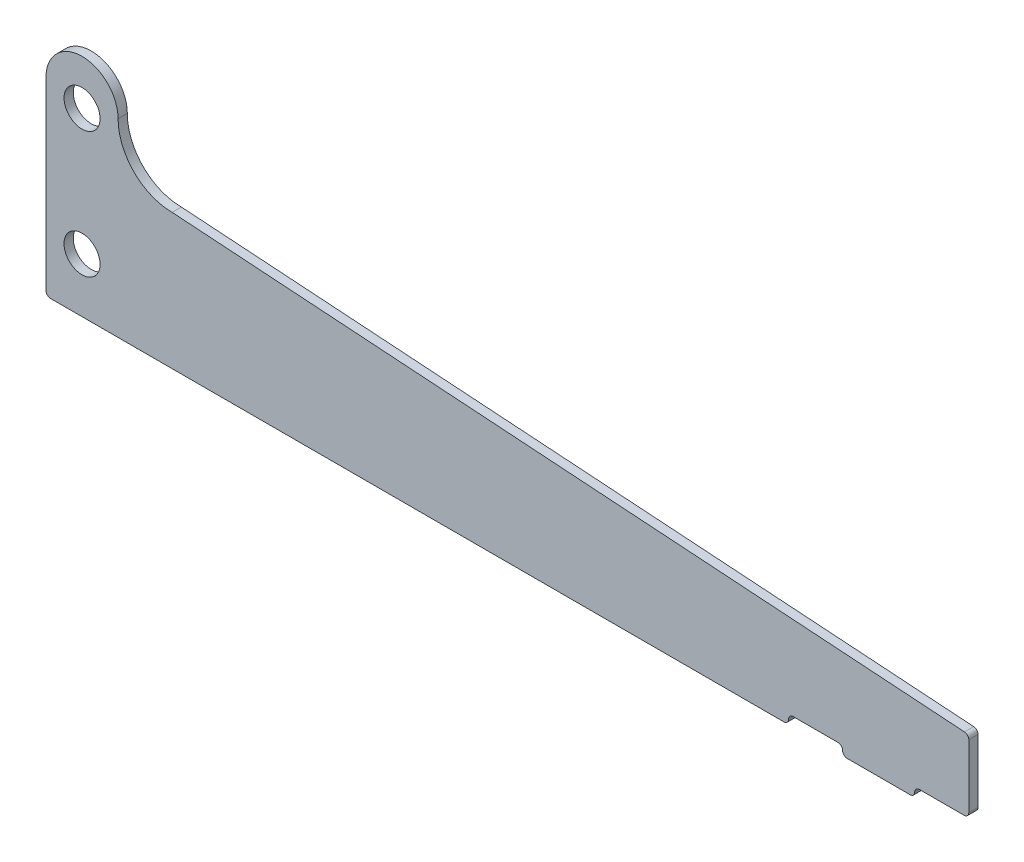
ISO-10303-21;
HEADER;
FILE_DESCRIPTION(('STEP AP214'),'2;1');
FILE_NAME('part.step','',(''),(''),'','','');
FILE_SCHEMA(('AUTOMOTIVE_DESIGN { 1 0 10303 214 1 1 1 1 }'));
ENDSEC;
DATA;
#1=APPLICATION_CONTEXT('core data for automotive mechanical design processes');
#2=APPLICATION_PROTOCOL_DEFINITION('international standard','automotive_design',2000,#1);
#3=PRODUCT_CONTEXT('',#1,'mechanical');
#4=PRODUCT('Part','Part','',(#3));
#5=PRODUCT_RELATED_PRODUCT_CATEGORY('part','',(#4));
#6=PRODUCT_DEFINITION_FORMATION('','',#4);
#7=PRODUCT_DEFINITION_CONTEXT('part definition',#1,'design');
#8=PRODUCT_DEFINITION('design','',#6,#7);
#9=PRODUCT_DEFINITION_SHAPE('','',#8);
#10=(LENGTH_UNIT() NAMED_UNIT(*) SI_UNIT(.MILLI.,.METRE.));
#11=(NAMED_UNIT(*) PLANE_ANGLE_UNIT() SI_UNIT($,.RADIAN.));
#12=(NAMED_UNIT(*) SI_UNIT($,.STERADIAN.) SOLID_ANGLE_UNIT());
#13=UNCERTAINTY_MEASURE_WITH_UNIT(LENGTH_MEASURE(1.E-05),#10,'distance_accuracy_value','');
#14=(GEOMETRIC_REPRESENTATION_CONTEXT(3) GLOBAL_UNCERTAINTY_ASSIGNED_CONTEXT((#13)) GLOBAL_UNIT_ASSIGNED_CONTEXT((#10,
#11,#12)) REPRESENTATION_CONTEXT('',''));
#15=CARTESIAN_POINT('',(0.,0.,0.));
#16=DIRECTION('',(0.,0.,1.));
#17=DIRECTION('',(1.,0.,0.));
#18=AXIS2_PLACEMENT_3D('',#15,#16,#17);
#19=CARTESIAN_POINT('',(11.1125,15.875,0.8128));
#20=DIRECTION('',(0.,0.,-1.));
#21=DIRECTION('',(-1.,0.,0.));
#22=AXIS2_PLACEMENT_3D('',#19,#20,#21);
#23=CYLINDRICAL_SURFACE('',#22,4.76250000000001);
#24=CARTESIAN_POINT('',(11.1125,15.875,0.));
#25=DIRECTION('',(0.,0.,1.));
#26=DIRECTION('',(1.,0.,0.));
#27=AXIS2_PLACEMENT_3D('',#24,#25,#26);
#28=CIRCLE('',#27,4.76250000000001);
#29=CARTESIAN_POINT('',(6.34999999999999,15.875,0.));
#30=VERTEX_POINT('',#29);
#31=CARTESIAN_POINT('',(11.1125,11.1125,0.));
#32=VERTEX_POINT('',#31);
#33=EDGE_CURVE('E175',#30,#32,#28,.T.);
#34=ORIENTED_EDGE('',*,*,#33,.F.);
#35=DIRECTION('',(0.,0.,-1.));
#36=VECTOR('',#35,1.);
#37=CARTESIAN_POINT('',(6.34999999999999,15.875,0.8128));
#38=LINE('',#37,#36);
#39=CARTESIAN_POINT('',(6.34999999999999,15.875,0.8128));
#40=VERTEX_POINT('',#39);
#41=EDGE_CURVE('E170',#40,#30,#38,.T.);
#42=ORIENTED_EDGE('',*,*,#41,.F.);
#43=CARTESIAN_POINT('',(11.1125,15.875,0.8128));
#44=DIRECTION('',(0.,0.,1.));
#45=DIRECTION('',(1.,0.,0.));
#46=AXIS2_PLACEMENT_3D('',#43,#44,#45);
#47=CIRCLE('',#46,4.76250000000001);
#48=CARTESIAN_POINT('',(11.1125,11.1125,0.8128));
#49=VERTEX_POINT('',#48);
#50=EDGE_CURVE('E173',#40,#49,#47,.T.);
#51=ORIENTED_EDGE('',*,*,#50,.T.);
#52=DIRECTION('',(0.,0.,-1.));
#53=VECTOR('',#52,1.);
#54=CARTESIAN_POINT('',(11.1125,11.1125,0.8128));
#55=LINE('',#54,#53);
#56=EDGE_CURVE('E231',#49,#32,#55,.T.);
#57=ORIENTED_EDGE('',*,*,#56,.T.);
#58=EDGE_LOOP('',(#34,#42,#51,#57));
#59=FACE_BOUND('',#58,.T.);
#60=ADVANCED_FACE('F41',(#59),#23,.F.);
#61=CARTESIAN_POINT('',(3.17499999999999,15.875,0.8128));
#62=DIRECTION('',(0.,0.,-1.));
#63=DIRECTION('',(-1.,0.,0.));
#64=AXIS2_PLACEMENT_3D('',#61,#62,#63);
#65=CYLINDRICAL_SURFACE('',#64,3.17499999999999);
#66=CARTESIAN_POINT('',(3.17499999999999,15.875,0.));
#67=DIRECTION('',(0.,0.,1.));
#68=DIRECTION('',(1.,0.,0.));
#69=AXIS2_PLACEMENT_3D('',#66,#67,#68);
#70=CIRCLE('',#69,3.17499999999999);
#71=CARTESIAN_POINT('',(0.,15.875,0.));
#72=VERTEX_POINT('',#71);
#73=EDGE_CURVE('E234',#30,#72,#70,.T.);
#74=ORIENTED_EDGE('',*,*,#73,.T.);
#75=DIRECTION('',(0.,0.,-1.));
#76=VECTOR('',#75,1.);
#77=CARTESIAN_POINT('',(0.,15.875,0.8128));
#78=LINE('',#77,#76);
#79=CARTESIAN_POINT('',(0.,15.875,0.8128));
#80=VERTEX_POINT('',#79);
#81=EDGE_CURVE('E181',#80,#72,#78,.T.);
#82=ORIENTED_EDGE('',*,*,#81,.F.);
#83=CARTESIAN_POINT('',(3.17499999999999,15.875,0.8128));
#84=DIRECTION('',(0.,0.,1.));
#85=DIRECTION('',(1.,0.,0.));
#86=AXIS2_PLACEMENT_3D('',#83,#84,#85);
#87=CIRCLE('',#86,3.17499999999999);
#88=EDGE_CURVE('E185',#40,#80,#87,.T.);
#89=ORIENTED_EDGE('',*,*,#88,.F.);
#90=ORIENTED_EDGE('',*,*,#41,.T.);
#91=EDGE_LOOP('',(#74,#82,#89,#90));
#92=FACE_BOUND('',#91,.T.);
#93=ADVANCED_FACE('F186',(#92),#65,.T.);
#94=CARTESIAN_POINT('',(0.,0.,0.8128));
#95=DIRECTION('',(-1.,0.,0.));
#96=DIRECTION('',(0.,0.,1.));
#97=AXIS2_PLACEMENT_3D('',#94,#95,#96);
#98=PLANE('',#97);
#99=DIRECTION('',(0.,1.,0.));
#100=VECTOR('',#99,1.);
#101=CARTESIAN_POINT('',(0.,0.,0.));
#102=LINE('',#101,#100);
#103=CARTESIAN_POINT('',(0.,-0.4064,0.));
#104=VERTEX_POINT('',#103);
#105=EDGE_CURVE('E238',#104,#72,#102,.T.);
#106=ORIENTED_EDGE('',*,*,#105,.F.);
#107=DIRECTION('',(0.,0.,-1.));
#108=VECTOR('',#107,1.);
#109=CARTESIAN_POINT('',(0.,-0.4064,0.8128));
#110=LINE('',#109,#108);
#111=CARTESIAN_POINT('',(0.,-0.4064,0.8128));
#112=VERTEX_POINT('',#111);
#113=EDGE_CURVE('E293',#104,#112,#110,.F.);
#114=ORIENTED_EDGE('',*,*,#113,.T.);
#115=DIRECTION('',(0.,1.,0.));
#116=VECTOR('',#115,1.);
#117=CARTESIAN_POINT('',(0.,0.,0.8128));
#118=LINE('',#117,#116);
#119=EDGE_CURVE('E190',#112,#80,#118,.T.);
#120=ORIENTED_EDGE('',*,*,#119,.T.);
#121=ORIENTED_EDGE('',*,*,#81,.T.);
#122=EDGE_LOOP('',(#106,#114,#120,#121));
#123=FACE_BOUND('',#122,.T.);
#124=ADVANCED_FACE('F394',(#123),#98,.T.);
#125=CARTESIAN_POINT('',(0.,-0.8128,0.8128));
#126=DIRECTION('',(0.,1.,0.));
#127=DIRECTION('',(-1.,0.,0.));
#128=AXIS2_PLACEMENT_3D('',#125,#126,#127);
#129=PLANE('',#128);
#130=DIRECTION('',(1.,0.,0.));
#131=VECTOR('',#130,1.);
#132=CARTESIAN_POINT('',(0.,-0.8128,0.8128));
#133=LINE('',#132,#131);
#134=CARTESIAN_POINT('',(0.4064,-0.8128,0.8128));
#135=VERTEX_POINT('',#134);
#136=CARTESIAN_POINT('',(65.0010384,-0.8128,0.8128));
#137=VERTEX_POINT('',#136);
#138=EDGE_CURVE('E205',#135,#137,#133,.T.);
#139=ORIENTED_EDGE('',*,*,#138,.F.);
#140=DIRECTION('',(0.,0.,-1.));
#141=VECTOR('',#140,1.);
#142=CARTESIAN_POINT('',(0.4064,-0.8128,0.));
#143=LINE('',#142,#141);
#144=CARTESIAN_POINT('',(0.4064,-0.8128,0.));
#145=VERTEX_POINT('',#144);
#146=EDGE_CURVE('E271',#135,#145,#143,.T.);
#147=ORIENTED_EDGE('',*,*,#146,.T.);
#148=DIRECTION('',(1.,0.,0.));
#149=VECTOR('',#148,1.);
#150=CARTESIAN_POINT('',(0.,-0.8128,0.));
#151=LINE('',#150,#149);
#152=CARTESIAN_POINT('',(65.0010384,-0.8128,0.));
#153=VERTEX_POINT('',#152);
#154=EDGE_CURVE('E241',#145,#153,#151,.T.);
#155=ORIENTED_EDGE('',*,*,#154,.T.);
#156=DIRECTION('',(0.,0.,-1.));
#157=VECTOR('',#156,1.);
#158=CARTESIAN_POINT('',(65.0010384,-0.8128,0.8128));
#159=LINE('',#158,#157);
#160=EDGE_CURVE('E180',#153,#137,#159,.F.);
#161=ORIENTED_EDGE('',*,*,#160,.T.);
#162=EDGE_LOOP('',(#139,#147,#155,#161));
#163=FACE_BOUND('',#162,.T.);
#164=ADVANCED_FACE('F384',(#163),#129,.F.);
#165=CARTESIAN_POINT('',(0.,0.,0.8128));
#166=DIRECTION('',(0.,-1.,0.));
#167=DIRECTION('',(1.,0.,0.));
#168=AXIS2_PLACEMENT_3D('',#165,#166,#167);
#169=PLANE('',#168);
#170=DIRECTION('',(-1.,0.,0.));
#171=VECTOR('',#170,1.);
#172=CARTESIAN_POINT('',(0.,0.,0.));
#173=LINE('',#172,#171);
#174=CARTESIAN_POINT('',(69.7635384,0.,0.));
#175=VERTEX_POINT('',#174);
#176=CARTESIAN_POINT('',(65.8138384,0.,0.));
#177=VERTEX_POINT('',#176);
#178=EDGE_CURVE('E247',#175,#177,#173,.T.);
#179=ORIENTED_EDGE('',*,*,#178,.F.);
#180=DIRECTION('',(0.,0.,-1.));
#181=VECTOR('',#180,1.);
#182=CARTESIAN_POINT('',(69.7635384,0.,0.8128));
#183=LINE('',#182,#181);
#184=CARTESIAN_POINT('',(69.7635384,0.,0.8128));
#185=VERTEX_POINT('',#184);
#186=EDGE_CURVE('E341',#175,#185,#183,.F.);
#187=ORIENTED_EDGE('',*,*,#186,.T.);
#188=DIRECTION('',(-1.,0.,0.));
#189=VECTOR('',#188,1.);
#190=CARTESIAN_POINT('',(0.,0.,0.8128));
#191=LINE('',#190,#189);
#192=CARTESIAN_POINT('',(65.8138384,0.,0.8128));
#193=VERTEX_POINT('',#192);
#194=EDGE_CURVE('E211',#185,#193,#191,.T.);
#195=ORIENTED_EDGE('',*,*,#194,.T.);
#196=DIRECTION('',(0.,0.,-1.));
#197=VECTOR('',#196,1.);
#198=CARTESIAN_POINT('',(65.8138384,0.,0.));
#199=LINE('',#198,#197);
#200=EDGE_CURVE('E337',#193,#177,#199,.T.);
#201=ORIENTED_EDGE('',*,*,#200,.T.);
#202=EDGE_LOOP('',(#179,#187,#195,#201));
#203=FACE_BOUND('',#202,.T.);
#204=ADVANCED_FACE('F436',(#203),#169,.T.);
#205=CARTESIAN_POINT('',(70.5763384,-0.8128,0.));
#206=VERTEX_POINT('',#205);
#207=CARTESIAN_POINT('',(76.1135384,-0.8128,0.));
#208=VERTEX_POINT('',#207);
#209=EDGE_CURVE('E242',#206,#208,#151,.T.);
#210=ORIENTED_EDGE('',*,*,#209,.T.);
#211=DIRECTION('',(0.,0.,-1.));
#212=VECTOR('',#211,1.);
#213=CARTESIAN_POINT('',(76.1135384,-0.8128,0.8128));
#214=LINE('',#213,#212);
#215=CARTESIAN_POINT('',(76.1135384,-0.8128,0.8128));
#216=VERTEX_POINT('',#215);
#217=EDGE_CURVE('E334',#208,#216,#214,.F.);
#218=ORIENTED_EDGE('',*,*,#217,.T.);
#219=CARTESIAN_POINT('',(70.5763384,-0.8128,0.8128));
#220=VERTEX_POINT('',#219);
#221=EDGE_CURVE('E206',#220,#216,#133,.T.);
#222=ORIENTED_EDGE('',*,*,#221,.F.);
#223=DIRECTION('',(0.,0.,-1.));
#224=VECTOR('',#223,1.);
#225=CARTESIAN_POINT('',(70.5763384,-0.8128,0.8128));
#226=LINE('',#225,#224);
#227=EDGE_CURVE('E330',#220,#206,#226,.T.);
#228=ORIENTED_EDGE('',*,*,#227,.T.);
#229=EDGE_LOOP('',(#210,#218,#222,#228));
#230=FACE_BOUND('',#229,.T.);
#231=ADVANCED_FACE('F425',(#230),#129,.F.);
#232=CARTESIAN_POINT('',(0.,0.,0.8128));
#233=DIRECTION('',(0.,-1.,0.));
#234=DIRECTION('',(0.,0.,-1.));
#235=AXIS2_PLACEMENT_3D('',#232,#233,#234);
#236=PLANE('',#235);
#237=DIRECTION('',(-1.,0.,0.));
#238=VECTOR('',#237,1.);
#239=CARTESIAN_POINT('',(0.,0.,0.));
#240=LINE('',#239,#238);
#241=CARTESIAN_POINT('',(80.8760384,0.,0.));
#242=VERTEX_POINT('',#241);
#243=CARTESIAN_POINT('',(76.9263384,0.,0.));
#244=VERTEX_POINT('',#243);
#245=EDGE_CURVE('E246',#242,#244,#240,.T.);
#246=ORIENTED_EDGE('',*,*,#245,.F.);
#247=DIRECTION('',(0.,0.,-1.));
#248=VECTOR('',#247,1.);
#249=CARTESIAN_POINT('',(80.8760384,0.,0.8128));
#250=LINE('',#249,#248);
#251=CARTESIAN_POINT('',(80.8760384,0.,0.8128));
#252=VERTEX_POINT('',#251);
#253=EDGE_CURVE('E327',#242,#252,#250,.F.);
#254=ORIENTED_EDGE('',*,*,#253,.T.);
#255=DIRECTION('',(-1.,0.,0.));
#256=VECTOR('',#255,1.);
#257=CARTESIAN_POINT('',(0.,0.,0.8128));
#258=LINE('',#257,#256);
#259=CARTESIAN_POINT('',(76.9263384,0.,0.8128));
#260=VERTEX_POINT('',#259);
#261=EDGE_CURVE('E210',#252,#260,#258,.T.);
#262=ORIENTED_EDGE('',*,*,#261,.T.);
#263=DIRECTION('',(0.,0.,-1.));
#264=VECTOR('',#263,1.);
#265=CARTESIAN_POINT('',(76.9263384,0.,0.8128));
#266=LINE('',#265,#264);
#267=EDGE_CURVE('E323',#260,#244,#266,.T.);
#268=ORIENTED_EDGE('',*,*,#267,.T.);
#269=EDGE_LOOP('',(#246,#254,#262,#268));
#270=FACE_BOUND('',#269,.T.);
#271=ADVANCED_FACE('F411',(#270),#236,.T.);
#272=CARTESIAN_POINT('',(81.2824384,0.,0.8128));
#273=DIRECTION('',(1.,0.,0.));
#274=DIRECTION('',(0.,0.,-1.));
#275=AXIS2_PLACEMENT_3D('',#272,#273,#274);
#276=PLANE('',#275);
#277=DIRECTION('',(0.,-1.,0.));
#278=VECTOR('',#277,1.);
#279=CARTESIAN_POINT('',(81.2824384,0.,0.));
#280=LINE('',#279,#278);
#281=CARTESIAN_POINT('',(81.2824384,5.97024779363954,0.));
#282=VERTEX_POINT('',#281);
#283=CARTESIAN_POINT('',(81.2824384,0.4064,0.));
#284=VERTEX_POINT('',#283);
#285=EDGE_CURVE('E254',#282,#284,#280,.T.);
#286=ORIENTED_EDGE('',*,*,#285,.F.);
#287=DIRECTION('',(0.,0.,-1.));
#288=VECTOR('',#287,1.);
#289=CARTESIAN_POINT('',(81.2824384,5.97024779363954,0.8128));
#290=LINE('',#289,#288);
#291=CARTESIAN_POINT('',(81.2824384,5.97024779363954,0.8128));
#292=VERTEX_POINT('',#291);
#293=EDGE_CURVE('E320',#282,#292,#290,.F.);
#294=ORIENTED_EDGE('',*,*,#293,.T.);
#295=DIRECTION('',(0.,-1.,0.));
#296=VECTOR('',#295,1.);
#297=CARTESIAN_POINT('',(81.2824384,0.,0.8128));
#298=LINE('',#297,#296);
#299=CARTESIAN_POINT('',(81.2824384,0.4064,0.8128));
#300=VERTEX_POINT('',#299);
#301=EDGE_CURVE('E218',#292,#300,#298,.T.);
#302=ORIENTED_EDGE('',*,*,#301,.T.);
#303=DIRECTION('',(0.,0.,-1.));
#304=VECTOR('',#303,1.);
#305=CARTESIAN_POINT('',(81.2824384,0.4064,0.8128));
#306=LINE('',#305,#304);
#307=EDGE_CURVE('E316',#300,#284,#306,.T.);
#308=ORIENTED_EDGE('',*,*,#307,.T.);
#309=EDGE_LOOP('',(#286,#294,#302,#308));
#310=FACE_BOUND('',#309,.T.);
#311=ADVANCED_FACE('F404',(#310),#276,.T.);
#312=CARTESIAN_POINT('',(3.17499999999999,3.96875,0.8128));
#313=DIRECTION('',(0.,0.,-1.));
#314=DIRECTION('',(-1.,0.,0.));
#315=AXIS2_PLACEMENT_3D('',#312,#313,#314);
#316=CYLINDRICAL_SURFACE('',#315,1.5875);
#317=CARTESIAN_POINT('',(3.17499999999999,3.96875,0.8128));
#318=DIRECTION('',(0.,0.,1.));
#319=DIRECTION('',(1.,0.,0.));
#320=AXIS2_PLACEMENT_3D('',#317,#318,#319);
#321=CIRCLE('',#320,1.5875);
#322=CARTESIAN_POINT('',(4.7625,3.96875,0.8128));
#323=VERTEX_POINT('',#322);
#324=EDGE_CURVE('E223',#323,#323,#321,.T.);
#325=ORIENTED_EDGE('',*,*,#324,.T.);
#326=EDGE_LOOP('',(#325));
#327=FACE_BOUND('',#326,.T.);
#328=CARTESIAN_POINT('',(3.17499999999999,3.96875,0.));
#329=DIRECTION('',(0.,0.,1.));
#330=DIRECTION('',(1.,0.,0.));
#331=AXIS2_PLACEMENT_3D('',#328,#329,#330);
#332=CIRCLE('',#331,1.5875);
#333=CARTESIAN_POINT('',(4.7625,3.96875,0.));
#334=VERTEX_POINT('',#333);
#335=EDGE_CURVE('E200',#334,#334,#332,.T.);
#336=ORIENTED_EDGE('',*,*,#335,.F.);
#337=EDGE_LOOP('',(#336));
#338=FACE_BOUND('',#337,.T.);
#339=ADVANCED_FACE('F528',(#327,#338),#316,.F.);
#340=CARTESIAN_POINT('',(0.801712156130444,11.8123029102791,0.8128));
#341=DIRECTION('',(0.0677151600119668,0.997704694338236,0.));
#342=DIRECTION('',(-0.997704694338237,0.0677151600119668,0.));
#343=AXIS2_PLACEMENT_3D('',#340,#341,#342);
#344=PLANE('',#343);
#345=DIRECTION('',(0.997704694338236,-0.0677151600119668,0.));
#346=VECTOR('',#345,1.);
#347=CARTESIAN_POINT('',(0.801712156130444,11.8123029102791,0.8128));
#348=LINE('',#347,#346);
#349=CARTESIAN_POINT('',(80.9035578410289,6.37571498141859,0.8128));
#350=VERTEX_POINT('',#349);
#351=EDGE_CURVE('E194',#49,#350,#348,.T.);
#352=ORIENTED_EDGE('',*,*,#351,.T.);
#353=DIRECTION('',(0.,0.,-1.));
#354=VECTOR('',#353,1.);
#355=CARTESIAN_POINT('',(80.9035578410289,6.37571498141859,0.8128));
#356=LINE('',#355,#354);
#357=CARTESIAN_POINT('',(80.9035578410289,6.37571498141859,0.));
#358=VERTEX_POINT('',#357);
#359=EDGE_CURVE('E312',#350,#358,#356,.T.);
#360=ORIENTED_EDGE('',*,*,#359,.T.);
#361=DIRECTION('',(0.997704694338236,-0.0677151600119668,0.));
#362=VECTOR('',#361,1.);
#363=CARTESIAN_POINT('',(0.801712156130444,11.8123029102791,0.));
#364=LINE('',#363,#362);
#365=EDGE_CURVE('E258',#32,#358,#364,.T.);
#366=ORIENTED_EDGE('',*,*,#365,.F.);
#367=ORIENTED_EDGE('',*,*,#56,.F.);
#368=EDGE_LOOP('',(#352,#360,#366,#367));
#369=FACE_BOUND('',#368,.T.);
#370=ADVANCED_FACE('F397',(#369),#344,.T.);
#371=CARTESIAN_POINT('',(3.17499999999999,15.08125,0.8128));
#372=DIRECTION('',(0.,0.,-1.));
#373=DIRECTION('',(-1.,0.,0.));
#374=AXIS2_PLACEMENT_3D('',#371,#372,#373);
#375=CYLINDRICAL_SURFACE('',#374,1.5875);
#376=CARTESIAN_POINT('',(3.17499999999999,15.08125,0.8128));
#377=DIRECTION('',(0.,0.,1.));
#378=DIRECTION('',(1.,0.,0.));
#379=AXIS2_PLACEMENT_3D('',#376,#377,#378);
#380=CIRCLE('',#379,1.5875);
#381=CARTESIAN_POINT('',(4.76249999999999,15.08125,0.8128));
#382=VERTEX_POINT('',#381);
#383=EDGE_CURVE('E227',#382,#382,#380,.T.);
#384=ORIENTED_EDGE('',*,*,#383,.T.);
#385=EDGE_LOOP('',(#384));
#386=FACE_BOUND('',#385,.T.);
#387=CARTESIAN_POINT('',(3.17499999999999,15.08125,0.));
#388=DIRECTION('',(0.,0.,1.));
#389=DIRECTION('',(1.,0.,0.));
#390=AXIS2_PLACEMENT_3D('',#387,#388,#389);
#391=CIRCLE('',#390,1.5875);
#392=CARTESIAN_POINT('',(4.76249999999999,15.08125,0.));
#393=VERTEX_POINT('',#392);
#394=EDGE_CURVE('E196',#393,#393,#391,.T.);
#395=ORIENTED_EDGE('',*,*,#394,.F.);
#396=EDGE_LOOP('',(#395));
#397=FACE_BOUND('',#396,.T.);
#398=ADVANCED_FACE('F512',(#386,#397),#375,.F.);
#399=CARTESIAN_POINT('',(0.,0.,0.8128));
#400=DIRECTION('',(0.,0.,1.));
#401=DIRECTION('',(1.,0.,0.));
#402=AXIS2_PLACEMENT_3D('',#399,#400,#401);
#403=PLANE('',#402);
#404=ORIENTED_EDGE('',*,*,#119,.F.);
#405=CARTESIAN_POINT('',(0.4064,-0.4064,0.8128));
#406=DIRECTION('',(0.,0.,1.));
#407=DIRECTION('',(1.,0.,0.));
#408=AXIS2_PLACEMENT_3D('',#405,#406,#407);
#409=CIRCLE('',#408,0.4064);
#410=EDGE_CURVE('E309',#112,#135,#409,.T.);
#411=ORIENTED_EDGE('',*,*,#410,.T.);
#412=ORIENTED_EDGE('',*,*,#138,.T.);
#413=CARTESIAN_POINT('',(65.0010384,-0.4064,0.8128));
#414=DIRECTION('',(0.,0.,1.));
#415=DIRECTION('',(1.,0.,0.));
#416=AXIS2_PLACEMENT_3D('',#413,#414,#415);
#417=CIRCLE('',#416,0.4064);
#418=CARTESIAN_POINT('',(65.4074384,-0.4064,0.8128));
#419=VERTEX_POINT('',#418);
#420=EDGE_CURVE('E296',#137,#419,#417,.T.);
#421=ORIENTED_EDGE('',*,*,#420,.T.);
#422=CARTESIAN_POINT('',(65.8138384,-0.4064,0.8128));
#423=DIRECTION('',(0.,0.,1.));
#424=DIRECTION('',(1.,0.,0.));
#425=AXIS2_PLACEMENT_3D('',#422,#423,#424);
#426=CIRCLE('',#425,0.4064);
#427=EDGE_CURVE('E11',#419,#193,#426,.F.);
#428=ORIENTED_EDGE('',*,*,#427,.T.);
#429=ORIENTED_EDGE('',*,*,#194,.F.);
#430=CARTESIAN_POINT('',(69.7635384,-0.4064,0.8128));
#431=DIRECTION('',(0.,0.,1.));
#432=DIRECTION('',(1.,0.,0.));
#433=AXIS2_PLACEMENT_3D('',#430,#431,#432);
#434=CIRCLE('',#433,0.4064);
#435=CARTESIAN_POINT('',(70.1699384,-0.4064,0.8128));
#436=VERTEX_POINT('',#435);
#437=EDGE_CURVE('E353',#185,#436,#434,.F.);
#438=ORIENTED_EDGE('',*,*,#437,.T.);
#439=CARTESIAN_POINT('',(70.5763384,-0.4064,0.8128));
#440=DIRECTION('',(0.,0.,1.));
#441=DIRECTION('',(1.,0.,0.));
#442=AXIS2_PLACEMENT_3D('',#439,#440,#441);
#443=CIRCLE('',#442,0.4064);
#444=EDGE_CURVE('E299',#436,#220,#443,.T.);
#445=ORIENTED_EDGE('',*,*,#444,.T.);
#446=ORIENTED_EDGE('',*,*,#221,.T.);
#447=CARTESIAN_POINT('',(76.1135384,-0.4064,0.8128));
#448=DIRECTION('',(0.,0.,1.));
#449=DIRECTION('',(1.,0.,0.));
#450=AXIS2_PLACEMENT_3D('',#447,#448,#449);
#451=CIRCLE('',#450,0.4064);
#452=CARTESIAN_POINT('',(76.5199384,-0.4064,0.8128));
#453=VERTEX_POINT('',#452);
#454=EDGE_CURVE('E302',#216,#453,#451,.T.);
#455=ORIENTED_EDGE('',*,*,#454,.T.);
#456=CARTESIAN_POINT('',(76.9263384,-0.4064,0.8128));
#457=DIRECTION('',(0.,0.,1.));
#458=DIRECTION('',(1.,0.,0.));
#459=AXIS2_PLACEMENT_3D('',#456,#457,#458);
#460=CIRCLE('',#459,0.4064);
#461=EDGE_CURVE('E347',#453,#260,#460,.F.);
#462=ORIENTED_EDGE('',*,*,#461,.T.);
#463=ORIENTED_EDGE('',*,*,#261,.F.);
#464=CARTESIAN_POINT('',(80.8760384,0.4064,0.8128));
#465=DIRECTION('',(0.,0.,1.));
#466=DIRECTION('',(1.,0.,0.));
#467=AXIS2_PLACEMENT_3D('',#464,#465,#466);
#468=CIRCLE('',#467,0.4064);
#469=EDGE_CURVE('E65',#252,#300,#468,.T.);
#470=ORIENTED_EDGE('',*,*,#469,.T.);
#471=ORIENTED_EDGE('',*,*,#301,.F.);
#472=CARTESIAN_POINT('',(80.8760384,5.97024779363954,0.8128));
#473=DIRECTION('',(0.,0.,1.));
#474=DIRECTION('',(1.,0.,0.));
#475=AXIS2_PLACEMENT_3D('',#472,#473,#474);
#476=CIRCLE('',#475,0.4064);
#477=EDGE_CURVE('E59',#292,#350,#476,.T.);
#478=ORIENTED_EDGE('',*,*,#477,.T.);
#479=ORIENTED_EDGE('',*,*,#351,.F.);
#480=ORIENTED_EDGE('',*,*,#50,.F.);
#481=ORIENTED_EDGE('',*,*,#88,.T.);
#482=EDGE_LOOP('',(#404,#411,#412,#421,#428,#429,#438,#445,#446,#455,#462,#463,#470,#471,#478,
#479,#480,#481));
#483=FACE_BOUND('',#482,.T.);
#484=ORIENTED_EDGE('',*,*,#324,.F.);
#485=EDGE_LOOP('',(#484));
#486=FACE_BOUND('',#485,.T.);
#487=ORIENTED_EDGE('',*,*,#383,.F.);
#488=EDGE_LOOP('',(#487));
#489=FACE_BOUND('',#488,.T.);
#490=ADVANCED_FACE('F192',(#483,#486,#489),#403,.T.);
#491=CARTESIAN_POINT('',(0.,0.,0.));
#492=DIRECTION('',(0.,0.,1.));
#493=DIRECTION('',(1.,0.,0.));
#494=AXIS2_PLACEMENT_3D('',#491,#492,#493);
#495=PLANE('',#494);
#496=ORIENTED_EDGE('',*,*,#154,.F.);
#497=CARTESIAN_POINT('',(0.4064,-0.4064,0.));
#498=DIRECTION('',(0.,0.,1.));
#499=DIRECTION('',(1.,0.,0.));
#500=AXIS2_PLACEMENT_3D('',#497,#498,#499);
#501=CIRCLE('',#500,0.4064);
#502=EDGE_CURVE('E290',#145,#104,#501,.F.);
#503=ORIENTED_EDGE('',*,*,#502,.T.);
#504=ORIENTED_EDGE('',*,*,#105,.T.);
#505=ORIENTED_EDGE('',*,*,#73,.F.);
#506=ORIENTED_EDGE('',*,*,#33,.T.);
#507=ORIENTED_EDGE('',*,*,#365,.T.);
#508=CARTESIAN_POINT('',(80.8760384,5.97024779363954,0.));
#509=DIRECTION('',(0.,0.,1.));
#510=DIRECTION('',(1.,0.,0.));
#511=AXIS2_PLACEMENT_3D('',#508,#509,#510);
#512=CIRCLE('',#511,0.4064);
#513=EDGE_CURVE('E287',#358,#282,#512,.F.);
#514=ORIENTED_EDGE('',*,*,#513,.T.);
#515=ORIENTED_EDGE('',*,*,#285,.T.);
#516=CARTESIAN_POINT('',(80.8760384,0.4064,0.));
#517=DIRECTION('',(0.,0.,1.));
#518=DIRECTION('',(1.,0.,0.));
#519=AXIS2_PLACEMENT_3D('',#516,#517,#518);
#520=CIRCLE('',#519,0.4064);
#521=EDGE_CURVE('E284',#284,#242,#520,.F.);
#522=ORIENTED_EDGE('',*,*,#521,.T.);
#523=ORIENTED_EDGE('',*,*,#245,.T.);
#524=CARTESIAN_POINT('',(76.9263384,-0.4064,0.));
#525=DIRECTION('',(0.,0.,1.));
#526=DIRECTION('',(1.,0.,0.));
#527=AXIS2_PLACEMENT_3D('',#524,#525,#526);
#528=CIRCLE('',#527,0.4064);
#529=CARTESIAN_POINT('',(76.5199384,-0.4064,0.));
#530=VERTEX_POINT('',#529);
#531=EDGE_CURVE('E344',#244,#530,#528,.T.);
#532=ORIENTED_EDGE('',*,*,#531,.T.);
#533=CARTESIAN_POINT('',(76.1135384,-0.4064,0.));
#534=DIRECTION('',(0.,0.,1.));
#535=DIRECTION('',(1.,0.,0.));
#536=AXIS2_PLACEMENT_3D('',#533,#534,#535);
#537=CIRCLE('',#536,0.4064);
#538=EDGE_CURVE('E281',#530,#208,#537,.F.);
#539=ORIENTED_EDGE('',*,*,#538,.T.);
#540=ORIENTED_EDGE('',*,*,#209,.F.);
#541=CARTESIAN_POINT('',(70.5763384,-0.4064,0.));
#542=DIRECTION('',(0.,0.,1.));
#543=DIRECTION('',(1.,0.,0.));
#544=AXIS2_PLACEMENT_3D('',#541,#542,#543);
#545=CIRCLE('',#544,0.4064);
#546=CARTESIAN_POINT('',(70.1699384,-0.4064,0.));
#547=VERTEX_POINT('',#546);
#548=EDGE_CURVE('E278',#206,#547,#545,.F.);
#549=ORIENTED_EDGE('',*,*,#548,.T.);
#550=CARTESIAN_POINT('',(69.7635384,-0.4064,0.));
#551=DIRECTION('',(0.,0.,1.));
#552=DIRECTION('',(1.,0.,0.));
#553=AXIS2_PLACEMENT_3D('',#550,#551,#552);
#554=CIRCLE('',#553,0.4064);
#555=EDGE_CURVE('E350',#547,#175,#554,.T.);
#556=ORIENTED_EDGE('',*,*,#555,.T.);
#557=ORIENTED_EDGE('',*,*,#178,.T.);
#558=CARTESIAN_POINT('',(65.8138384,-0.4064,0.));
#559=DIRECTION('',(0.,0.,1.));
#560=DIRECTION('',(1.,0.,0.));
#561=AXIS2_PLACEMENT_3D('',#558,#559,#560);
#562=CIRCLE('',#561,0.4064);
#563=CARTESIAN_POINT('',(65.4074384,-0.4064,0.));
#564=VERTEX_POINT('',#563);
#565=EDGE_CURVE('E51',#177,#564,#562,.T.);
#566=ORIENTED_EDGE('',*,*,#565,.T.);
#567=CARTESIAN_POINT('',(65.0010384,-0.4064,0.));
#568=DIRECTION('',(0.,0.,1.));
#569=DIRECTION('',(1.,0.,0.));
#570=AXIS2_PLACEMENT_3D('',#567,#568,#569);
#571=CIRCLE('',#570,0.4064);
#572=EDGE_CURVE('E275',#564,#153,#571,.F.);
#573=ORIENTED_EDGE('',*,*,#572,.T.);
#574=EDGE_LOOP('',(#496,#503,#504,#505,#506,#507,#514,#515,#522,#523,#532,#539,#540,#549,#556,
#557,#566,#573));
#575=FACE_BOUND('',#574,.T.);
#576=ORIENTED_EDGE('',*,*,#335,.T.);
#577=EDGE_LOOP('',(#576));
#578=FACE_BOUND('',#577,.T.);
#579=ORIENTED_EDGE('',*,*,#394,.T.);
#580=EDGE_LOOP('',(#579));
#581=FACE_BOUND('',#580,.T.);
#582=ADVANCED_FACE('F380',(#575,#578,#581),#495,.F.);
#583=CARTESIAN_POINT('',(0.4064,-0.4064,0.8128));
#584=DIRECTION('',(0.,0.,1.));
#585=DIRECTION('',(1.,0.,0.));
#586=AXIS2_PLACEMENT_3D('',#583,#584,#585);
#587=CYLINDRICAL_SURFACE('',#586,0.4064);
#588=ORIENTED_EDGE('',*,*,#410,.F.);
#589=ORIENTED_EDGE('',*,*,#113,.F.);
#590=ORIENTED_EDGE('',*,*,#502,.F.);
#591=ORIENTED_EDGE('',*,*,#146,.F.);
#592=EDGE_LOOP('',(#588,#589,#590,#591));
#593=FACE_BOUND('',#592,.T.);
#594=ADVANCED_FACE('F390',(#593),#587,.T.);
#595=CARTESIAN_POINT('',(80.8760384,5.97024779363954,0.8128));
#596=DIRECTION('',(0.,0.,-1.));
#597=DIRECTION('',(-1.,0.,0.));
#598=AXIS2_PLACEMENT_3D('',#595,#596,#597);
#599=CYLINDRICAL_SURFACE('',#598,0.4064);
#600=ORIENTED_EDGE('',*,*,#477,.F.);
#601=ORIENTED_EDGE('',*,*,#293,.F.);
#602=ORIENTED_EDGE('',*,*,#513,.F.);
#603=ORIENTED_EDGE('',*,*,#359,.F.);
#604=EDGE_LOOP('',(#600,#601,#602,#603));
#605=FACE_BOUND('',#604,.T.);
#606=ADVANCED_FACE('F400',(#605),#599,.T.);
#607=CARTESIAN_POINT('',(80.8760384,0.4064,0.8128));
#608=DIRECTION('',(0.,0.,-1.));
#609=DIRECTION('',(-1.,0.,0.));
#610=AXIS2_PLACEMENT_3D('',#607,#608,#609);
#611=CYLINDRICAL_SURFACE('',#610,0.4064);
#612=ORIENTED_EDGE('',*,*,#469,.F.);
#613=ORIENTED_EDGE('',*,*,#253,.F.);
#614=ORIENTED_EDGE('',*,*,#521,.F.);
#615=ORIENTED_EDGE('',*,*,#307,.F.);
#616=EDGE_LOOP('',(#612,#613,#614,#615));
#617=FACE_BOUND('',#616,.T.);
#618=ADVANCED_FACE('F407',(#617),#611,.T.);
#619=CARTESIAN_POINT('',(76.1135384,-0.4064,0.8128));
#620=DIRECTION('',(0.,0.,-1.));
#621=DIRECTION('',(-1.,0.,0.));
#622=AXIS2_PLACEMENT_3D('',#619,#620,#621);
#623=CYLINDRICAL_SURFACE('',#622,0.4064);
#624=DIRECTION('',(0.,0.,-1.));
#625=VECTOR('',#624,1.);
#626=CARTESIAN_POINT('',(76.5199384,-0.4064,0.8128));
#627=LINE('',#626,#625);
#628=EDGE_CURVE('E235',#453,#530,#627,.T.);
#629=ORIENTED_EDGE('',*,*,#628,.F.);
#630=ORIENTED_EDGE('',*,*,#454,.F.);
#631=ORIENTED_EDGE('',*,*,#217,.F.);
#632=ORIENTED_EDGE('',*,*,#538,.F.);
#633=EDGE_LOOP('',(#629,#630,#631,#632));
#634=FACE_BOUND('',#633,.T.);
#635=ADVANCED_FACE('F421',(#634),#623,.T.);
#636=CARTESIAN_POINT('',(76.9263384,-0.4064,0.8128));
#637=DIRECTION('',(0.,0.,-1.));
#638=DIRECTION('',(-1.,0.,0.));
#639=AXIS2_PLACEMENT_3D('',#636,#637,#638);
#640=CYLINDRICAL_SURFACE('',#639,0.4064);
#641=ORIENTED_EDGE('',*,*,#461,.F.);
#642=ORIENTED_EDGE('',*,*,#628,.T.);
#643=ORIENTED_EDGE('',*,*,#531,.F.);
#644=ORIENTED_EDGE('',*,*,#267,.F.);
#645=EDGE_LOOP('',(#641,#642,#643,#644));
#646=FACE_BOUND('',#645,.T.);
#647=ADVANCED_FACE('F415',(#646),#640,.F.);
#648=CARTESIAN_POINT('',(69.7635384,-0.4064,0.8128));
#649=DIRECTION('',(0.,0.,-1.));
#650=DIRECTION('',(-1.,0.,0.));
#651=AXIS2_PLACEMENT_3D('',#648,#649,#650);
#652=CYLINDRICAL_SURFACE('',#651,0.4064);
#653=DIRECTION('',(0.,0.,-1.));
#654=VECTOR('',#653,1.);
#655=CARTESIAN_POINT('',(70.1699384,-0.4064,0.8128));
#656=LINE('',#655,#654);
#657=EDGE_CURVE('E360',#436,#547,#656,.T.);
#658=ORIENTED_EDGE('',*,*,#657,.F.);
#659=ORIENTED_EDGE('',*,*,#437,.F.);
#660=ORIENTED_EDGE('',*,*,#186,.F.);
#661=ORIENTED_EDGE('',*,*,#555,.F.);
#662=EDGE_LOOP('',(#658,#659,#660,#661));
#663=FACE_BOUND('',#662,.T.);
#664=ADVANCED_FACE('F434',(#663),#652,.F.);
#665=CARTESIAN_POINT('',(70.5763384,-0.4064,0.8128));
#666=DIRECTION('',(0.,0.,-1.));
#667=DIRECTION('',(-1.,0.,0.));
#668=AXIS2_PLACEMENT_3D('',#665,#666,#667);
#669=CYLINDRICAL_SURFACE('',#668,0.4064);
#670=ORIENTED_EDGE('',*,*,#444,.F.);
#671=ORIENTED_EDGE('',*,*,#657,.T.);
#672=ORIENTED_EDGE('',*,*,#548,.F.);
#673=ORIENTED_EDGE('',*,*,#227,.F.);
#674=EDGE_LOOP('',(#670,#671,#672,#673));
#675=FACE_BOUND('',#674,.T.);
#676=ADVANCED_FACE('F429',(#675),#669,.T.);
#677=CARTESIAN_POINT('',(65.0010384,-0.4064,0.8128));
#678=DIRECTION('',(0.,0.,1.));
#679=DIRECTION('',(1.,0.,0.));
#680=AXIS2_PLACEMENT_3D('',#677,#678,#679);
#681=CYLINDRICAL_SURFACE('',#680,0.4064);
#682=DIRECTION('',(0.,0.,-1.));
#683=VECTOR('',#682,1.);
#684=CARTESIAN_POINT('',(65.4074384,-0.4064,0.));
#685=LINE('',#684,#683);
#686=EDGE_CURVE('E45',#419,#564,#685,.T.);
#687=ORIENTED_EDGE('',*,*,#686,.F.);
#688=ORIENTED_EDGE('',*,*,#420,.F.);
#689=ORIENTED_EDGE('',*,*,#160,.F.);
#690=ORIENTED_EDGE('',*,*,#572,.F.);
#691=EDGE_LOOP('',(#687,#688,#689,#690));
#692=FACE_BOUND('',#691,.T.);
#693=ADVANCED_FACE('F43',(#692),#681,.T.);
#694=CARTESIAN_POINT('',(65.8138384,-0.4064,0.8128));
#695=DIRECTION('',(0.,0.,1.));
#696=DIRECTION('',(1.,0.,0.));
#697=AXIS2_PLACEMENT_3D('',#694,#695,#696);
#698=CYLINDRICAL_SURFACE('',#697,0.4064);
#699=ORIENTED_EDGE('',*,*,#427,.F.);
#700=ORIENTED_EDGE('',*,*,#686,.T.);
#701=ORIENTED_EDGE('',*,*,#565,.F.);
#702=ORIENTED_EDGE('',*,*,#200,.F.);
#703=EDGE_LOOP('',(#699,#700,#701,#702));
#704=FACE_BOUND('',#703,.T.);
#705=ADVANCED_FACE('F371',(#704),#698,.F.);
#706=CLOSED_SHELL('',(#60,#93,#124,#164,#204,#231,#271,#311,#339,#370,#398,#490,#582,#594,#606,
#618,#635,#647,#664,#676,#693,#705));
#707=MANIFOLD_SOLID_BREP('B2',#706);
#708=ADVANCED_BREP_SHAPE_REPRESENTATION('',(#18,#707),#14);
#709=SHAPE_DEFINITION_REPRESENTATION(#9,#708);
ENDSEC;
END-ISO-10303-21;
